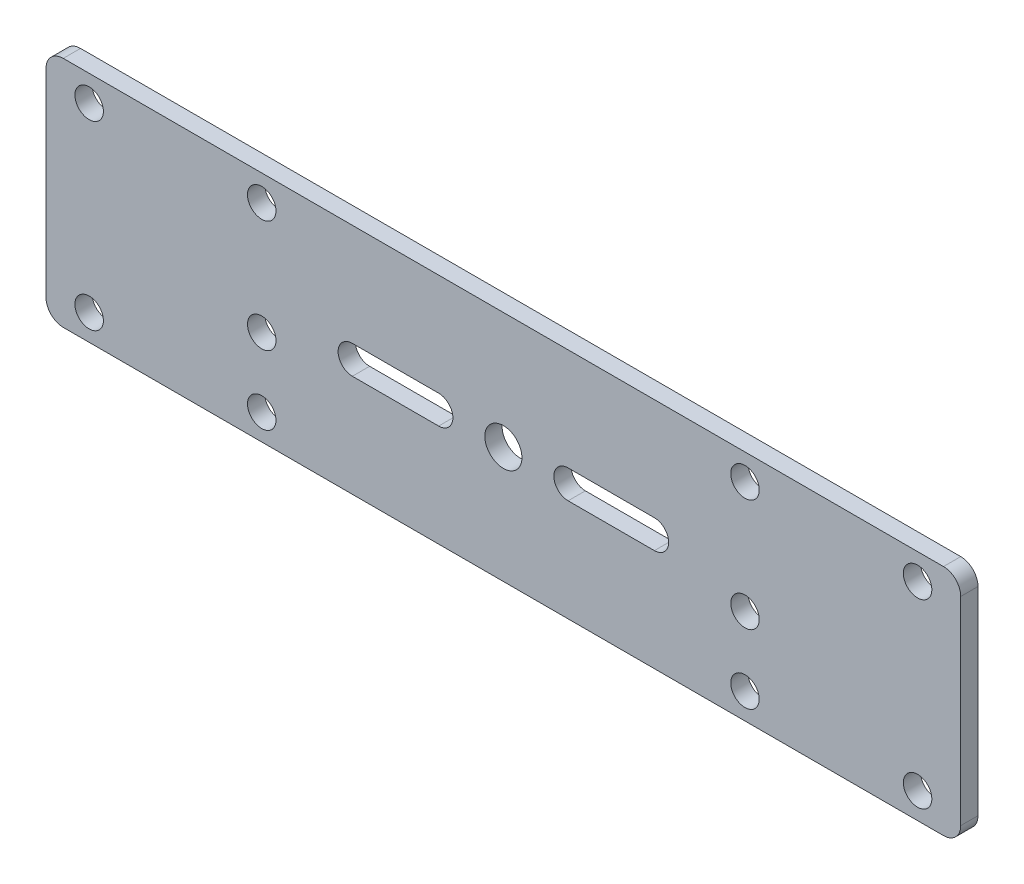
ISO-10303-21;
HEADER;
FILE_DESCRIPTION(('STEP AP214'),'2;1');
FILE_NAME('part.step','',(''),(''),'','','');
FILE_SCHEMA(('AUTOMOTIVE_DESIGN { 1 0 10303 214 1 1 1 1 }'));
ENDSEC;
DATA;
#1=APPLICATION_CONTEXT('core data for automotive mechanical design processes');
#2=APPLICATION_PROTOCOL_DEFINITION('international standard','automotive_design',2000,#1);
#3=PRODUCT_CONTEXT('',#1,'mechanical');
#4=PRODUCT('Part','Part','',(#3));
#5=PRODUCT_RELATED_PRODUCT_CATEGORY('part','',(#4));
#6=PRODUCT_DEFINITION_FORMATION('','',#4);
#7=PRODUCT_DEFINITION_CONTEXT('part definition',#1,'design');
#8=PRODUCT_DEFINITION('design','',#6,#7);
#9=PRODUCT_DEFINITION_SHAPE('','',#8);
#10=(LENGTH_UNIT() NAMED_UNIT(*) SI_UNIT(.MILLI.,.METRE.));
#11=(NAMED_UNIT(*) PLANE_ANGLE_UNIT() SI_UNIT($,.RADIAN.));
#12=(NAMED_UNIT(*) SI_UNIT($,.STERADIAN.) SOLID_ANGLE_UNIT());
#13=UNCERTAINTY_MEASURE_WITH_UNIT(LENGTH_MEASURE(1.E-05),#10,'distance_accuracy_value','');
#14=(GEOMETRIC_REPRESENTATION_CONTEXT(3) GLOBAL_UNCERTAINTY_ASSIGNED_CONTEXT((#13)) GLOBAL_UNIT_ASSIGNED_CONTEXT((#10,
#11,#12)) REPRESENTATION_CONTEXT('',''));
#15=CARTESIAN_POINT('',(0.,0.,0.));
#16=DIRECTION('',(0.,0.,1.));
#17=DIRECTION('',(1.,0.,0.));
#18=AXIS2_PLACEMENT_3D('',#15,#16,#17);
#19=CARTESIAN_POINT('',(0.,0.,2.));
#20=DIRECTION('',(0.,0.,1.));
#21=DIRECTION('',(1.,0.,0.));
#22=AXIS2_PLACEMENT_3D('',#19,#20,#21);
#23=PLANE('',#22);
#24=DIRECTION('',(0.,1.,0.));
#25=VECTOR('',#24,1.);
#26=CARTESIAN_POINT('',(53.,12.5,2.));
#27=LINE('',#26,#25);
#28=CARTESIAN_POINT('',(53.,-16.5,2.));
#29=VERTEX_POINT('',#28);
#30=CARTESIAN_POINT('',(53.,6.50000000000001,2.));
#31=VERTEX_POINT('',#30);
#32=EDGE_CURVE('E325',#29,#31,#27,.T.);
#33=ORIENTED_EDGE('',*,*,#32,.T.);
#34=CARTESIAN_POINT('',(51.,6.50000000000001,2.));
#35=DIRECTION('',(0.,0.,1.));
#36=DIRECTION('',(1.,0.,0.));
#37=AXIS2_PLACEMENT_3D('',#34,#35,#36);
#38=CIRCLE('',#37,2.);
#39=CARTESIAN_POINT('',(51.,8.50000000000001,2.));
#40=VERTEX_POINT('',#39);
#41=EDGE_CURVE('E385',#31,#40,#38,.T.);
#42=ORIENTED_EDGE('',*,*,#41,.T.);
#43=DIRECTION('',(1.,0.,0.));
#44=VECTOR('',#43,1.);
#45=CARTESIAN_POINT('',(-53.,8.50000000000001,2.));
#46=LINE('',#45,#44);
#47=CARTESIAN_POINT('',(-51.,8.50000000000001,2.));
#48=VERTEX_POINT('',#47);
#49=EDGE_CURVE('E430',#48,#40,#46,.T.);
#50=ORIENTED_EDGE('',*,*,#49,.F.);
#51=CARTESIAN_POINT('',(-51.,6.50000000000001,2.));
#52=DIRECTION('',(0.,0.,1.));
#53=DIRECTION('',(1.,0.,0.));
#54=AXIS2_PLACEMENT_3D('',#51,#52,#53);
#55=CIRCLE('',#54,2.);
#56=CARTESIAN_POINT('',(-53.,6.50000000000001,2.));
#57=VERTEX_POINT('',#56);
#58=EDGE_CURVE('E376',#48,#57,#55,.T.);
#59=ORIENTED_EDGE('',*,*,#58,.T.);
#60=DIRECTION('',(0.,-1.,0.));
#61=VECTOR('',#60,1.);
#62=CARTESIAN_POINT('',(-53.,12.5,2.));
#63=LINE('',#62,#61);
#64=CARTESIAN_POINT('',(-53.,-16.5,2.));
#65=VERTEX_POINT('',#64);
#66=EDGE_CURVE('E329',#57,#65,#63,.T.);
#67=ORIENTED_EDGE('',*,*,#66,.T.);
#68=CARTESIAN_POINT('',(-51.,-16.5,2.));
#69=DIRECTION('',(0.,0.,1.));
#70=DIRECTION('',(1.,0.,0.));
#71=AXIS2_PLACEMENT_3D('',#68,#69,#70);
#72=CIRCLE('',#71,2.);
#73=CARTESIAN_POINT('',(-51.,-18.5,2.));
#74=VERTEX_POINT('',#73);
#75=EDGE_CURVE('E379',#65,#74,#72,.T.);
#76=ORIENTED_EDGE('',*,*,#75,.T.);
#77=DIRECTION('',(1.,0.,0.));
#78=VECTOR('',#77,1.);
#79=CARTESIAN_POINT('',(-53.,-18.5,2.));
#80=LINE('',#79,#78);
#81=CARTESIAN_POINT('',(51.,-18.5,2.));
#82=VERTEX_POINT('',#81);
#83=EDGE_CURVE('E234',#74,#82,#80,.T.);
#84=ORIENTED_EDGE('',*,*,#83,.T.);
#85=CARTESIAN_POINT('',(51.,-16.5,2.));
#86=DIRECTION('',(0.,0.,1.));
#87=DIRECTION('',(1.,0.,0.));
#88=AXIS2_PLACEMENT_3D('',#85,#86,#87);
#89=CIRCLE('',#88,2.);
#90=EDGE_CURVE('E382',#82,#29,#89,.T.);
#91=ORIENTED_EDGE('',*,*,#90,.T.);
#92=EDGE_LOOP('',(#33,#42,#50,#59,#67,#76,#84,#91));
#93=FACE_BOUND('',#92,.T.);
#94=CARTESIAN_POINT('',(-17.5,-5.00000000000001,2.));
#95=DIRECTION('',(0.,0.,1.));
#96=DIRECTION('',(1.,0.,0.));
#97=AXIS2_PLACEMENT_3D('',#94,#95,#96);
#98=CIRCLE('',#97,1.65000000000001);
#99=CARTESIAN_POINT('',(-17.5,-3.35,2.));
#100=VERTEX_POINT('',#99);
#101=CARTESIAN_POINT('',(-17.5,-6.65000000000001,2.));
#102=VERTEX_POINT('',#101);
#103=EDGE_CURVE('E182',#100,#102,#98,.T.);
#104=ORIENTED_EDGE('',*,*,#103,.F.);
#105=DIRECTION('',(-1.,0.,0.));
#106=VECTOR('',#105,1.);
#107=CARTESIAN_POINT('',(-17.5,-3.35,2.));
#108=LINE('',#107,#106);
#109=CARTESIAN_POINT('',(-7.5,-3.35,2.));
#110=VERTEX_POINT('',#109);
#111=EDGE_CURVE('E186',#110,#100,#108,.T.);
#112=ORIENTED_EDGE('',*,*,#111,.F.);
#113=CARTESIAN_POINT('',(-7.50000000000001,-5.00000000000001,2.));
#114=DIRECTION('',(0.,0.,1.));
#115=DIRECTION('',(1.,0.,0.));
#116=AXIS2_PLACEMENT_3D('',#113,#114,#115);
#117=CIRCLE('',#116,1.65000000000001);
#118=CARTESIAN_POINT('',(-7.5,-6.65000000000002,2.));
#119=VERTEX_POINT('',#118);
#120=EDGE_CURVE('E164',#119,#110,#117,.T.);
#121=ORIENTED_EDGE('',*,*,#120,.F.);
#122=DIRECTION('',(1.,0.,0.));
#123=VECTOR('',#122,1.);
#124=CARTESIAN_POINT('',(-17.5,-6.65000000000001,2.));
#125=LINE('',#124,#123);
#126=EDGE_CURVE('E176',#102,#119,#125,.T.);
#127=ORIENTED_EDGE('',*,*,#126,.F.);
#128=EDGE_LOOP('',(#104,#112,#121,#127));
#129=FACE_BOUND('',#128,.T.);
#130=CARTESIAN_POINT('',(17.5,-5.00000000000001,2.));
#131=DIRECTION('',(0.,0.,1.));
#132=DIRECTION('',(-1.,0.,0.));
#133=AXIS2_PLACEMENT_3D('',#130,#131,#132);
#134=CIRCLE('',#133,1.65000000000001);
#135=CARTESIAN_POINT('',(17.5,-6.65000000000001,2.));
#136=VERTEX_POINT('',#135);
#137=CARTESIAN_POINT('',(17.5,-3.35,2.));
#138=VERTEX_POINT('',#137);
#139=EDGE_CURVE('E227',#136,#138,#134,.T.);
#140=ORIENTED_EDGE('',*,*,#139,.F.);
#141=DIRECTION('',(1.,0.,0.));
#142=VECTOR('',#141,1.);
#143=CARTESIAN_POINT('',(17.5,-6.65000000000001,2.));
#144=LINE('',#143,#142);
#145=CARTESIAN_POINT('',(7.5,-6.65000000000002,2.));
#146=VERTEX_POINT('',#145);
#147=EDGE_CURVE('E205',#146,#136,#144,.T.);
#148=ORIENTED_EDGE('',*,*,#147,.F.);
#149=CARTESIAN_POINT('',(7.50000000000001,-5.00000000000001,2.));
#150=DIRECTION('',(0.,0.,1.));
#151=DIRECTION('',(-1.,0.,0.));
#152=AXIS2_PLACEMENT_3D('',#149,#150,#151);
#153=CIRCLE('',#152,1.65000000000001);
#154=CARTESIAN_POINT('',(7.5,-3.35,2.));
#155=VERTEX_POINT('',#154);
#156=EDGE_CURVE('E219',#155,#146,#153,.T.);
#157=ORIENTED_EDGE('',*,*,#156,.F.);
#158=DIRECTION('',(-1.,0.,0.));
#159=VECTOR('',#158,1.);
#160=CARTESIAN_POINT('',(17.5,-3.35,2.));
#161=LINE('',#160,#159);
#162=EDGE_CURVE('E223',#138,#155,#161,.T.);
#163=ORIENTED_EDGE('',*,*,#162,.F.);
#164=EDGE_LOOP('',(#140,#148,#157,#163));
#165=FACE_BOUND('',#164,.T.);
#166=CARTESIAN_POINT('',(-48.,-15.5,2.));
#167=DIRECTION('',(0.,0.,1.));
#168=DIRECTION('',(1.,0.,0.));
#169=AXIS2_PLACEMENT_3D('',#166,#167,#168);
#170=CIRCLE('',#169,1.65);
#171=CARTESIAN_POINT('',(-46.35,-15.5,2.));
#172=VERTEX_POINT('',#171);
#173=EDGE_CURVE('E235',#172,#172,#170,.T.);
#174=ORIENTED_EDGE('',*,*,#173,.F.);
#175=EDGE_LOOP('',(#174));
#176=FACE_BOUND('',#175,.T.);
#177=CARTESIAN_POINT('',(28.,-15.5,2.));
#178=DIRECTION('',(0.,0.,1.));
#179=DIRECTION('',(-1.,0.,0.));
#180=AXIS2_PLACEMENT_3D('',#177,#178,#179);
#181=CIRCLE('',#180,1.65);
#182=CARTESIAN_POINT('',(26.35,-15.5,2.));
#183=VERTEX_POINT('',#182);
#184=EDGE_CURVE('E240',#183,#183,#181,.T.);
#185=ORIENTED_EDGE('',*,*,#184,.F.);
#186=EDGE_LOOP('',(#185));
#187=FACE_BOUND('',#186,.T.);
#188=CARTESIAN_POINT('',(-28.,-15.5,2.));
#189=DIRECTION('',(0.,0.,1.));
#190=DIRECTION('',(1.,0.,0.));
#191=AXIS2_PLACEMENT_3D('',#188,#189,#190);
#192=CIRCLE('',#191,1.65);
#193=CARTESIAN_POINT('',(-26.35,-15.5,2.));
#194=VERTEX_POINT('',#193);
#195=EDGE_CURVE('E255',#194,#194,#192,.T.);
#196=ORIENTED_EDGE('',*,*,#195,.F.);
#197=EDGE_LOOP('',(#196));
#198=FACE_BOUND('',#197,.T.);
#199=CARTESIAN_POINT('',(48.,-15.5,2.));
#200=DIRECTION('',(0.,0.,1.));
#201=DIRECTION('',(-1.,0.,0.));
#202=AXIS2_PLACEMENT_3D('',#199,#200,#201);
#203=CIRCLE('',#202,1.65);
#204=CARTESIAN_POINT('',(46.35,-15.5,2.));
#205=VERTEX_POINT('',#204);
#206=EDGE_CURVE('E239',#205,#205,#203,.T.);
#207=ORIENTED_EDGE('',*,*,#206,.F.);
#208=EDGE_LOOP('',(#207));
#209=FACE_BOUND('',#208,.T.);
#210=CARTESIAN_POINT('',(0.,-5.00000000000002,2.));
#211=DIRECTION('',(0.,0.,1.));
#212=DIRECTION('',(1.,0.,0.));
#213=AXIS2_PLACEMENT_3D('',#210,#211,#212);
#214=CIRCLE('',#213,2.15);
#215=CARTESIAN_POINT('',(2.15,-5.00000000000002,2.));
#216=VERTEX_POINT('',#215);
#217=EDGE_CURVE('E277',#216,#216,#214,.T.);
#218=ORIENTED_EDGE('',*,*,#217,.F.);
#219=EDGE_LOOP('',(#218));
#220=FACE_BOUND('',#219,.T.);
#221=CARTESIAN_POINT('',(28.,5.5,2.));
#222=DIRECTION('',(0.,0.,1.));
#223=DIRECTION('',(-1.,0.,0.));
#224=AXIS2_PLACEMENT_3D('',#221,#222,#223);
#225=CIRCLE('',#224,1.65);
#226=CARTESIAN_POINT('',(26.35,5.5,2.));
#227=VERTEX_POINT('',#226);
#228=EDGE_CURVE('E293',#227,#227,#225,.T.);
#229=ORIENTED_EDGE('',*,*,#228,.F.);
#230=EDGE_LOOP('',(#229));
#231=FACE_BOUND('',#230,.T.);
#232=CARTESIAN_POINT('',(-28.,-7.5,2.));
#233=DIRECTION('',(0.,0.,1.));
#234=DIRECTION('',(-1.,0.,0.));
#235=AXIS2_PLACEMENT_3D('',#232,#233,#234);
#236=CIRCLE('',#235,1.65);
#237=CARTESIAN_POINT('',(-29.65,-7.5,2.));
#238=VERTEX_POINT('',#237);
#239=EDGE_CURVE('E309',#238,#238,#236,.T.);
#240=ORIENTED_EDGE('',*,*,#239,.F.);
#241=EDGE_LOOP('',(#240));
#242=FACE_BOUND('',#241,.T.);
#243=CARTESIAN_POINT('',(-28.,5.5,2.));
#244=DIRECTION('',(0.,0.,1.));
#245=DIRECTION('',(1.,0.,0.));
#246=AXIS2_PLACEMENT_3D('',#243,#244,#245);
#247=CIRCLE('',#246,1.65);
#248=CARTESIAN_POINT('',(-26.35,5.5,2.));
#249=VERTEX_POINT('',#248);
#250=EDGE_CURVE('E317',#249,#249,#247,.T.);
#251=ORIENTED_EDGE('',*,*,#250,.F.);
#252=EDGE_LOOP('',(#251));
#253=FACE_BOUND('',#252,.T.);
#254=CARTESIAN_POINT('',(28.,-7.5,2.));
#255=DIRECTION('',(0.,0.,1.));
#256=DIRECTION('',(1.,0.,0.));
#257=AXIS2_PLACEMENT_3D('',#254,#255,#256);
#258=CIRCLE('',#257,1.65);
#259=CARTESIAN_POINT('',(29.65,-7.5,2.));
#260=VERTEX_POINT('',#259);
#261=EDGE_CURVE('E301',#260,#260,#258,.T.);
#262=ORIENTED_EDGE('',*,*,#261,.F.);
#263=EDGE_LOOP('',(#262));
#264=FACE_BOUND('',#263,.T.);
#265=CARTESIAN_POINT('',(48.,5.50000000000001,2.));
#266=DIRECTION('',(0.,0.,1.));
#267=DIRECTION('',(-1.,0.,0.));
#268=AXIS2_PLACEMENT_3D('',#265,#266,#267);
#269=CIRCLE('',#268,1.65);
#270=CARTESIAN_POINT('',(46.35,5.50000000000001,2.));
#271=VERTEX_POINT('',#270);
#272=EDGE_CURVE('E285',#271,#271,#269,.T.);
#273=ORIENTED_EDGE('',*,*,#272,.F.);
#274=EDGE_LOOP('',(#273));
#275=FACE_BOUND('',#274,.T.);
#276=CARTESIAN_POINT('',(-48.,5.5,2.));
#277=DIRECTION('',(0.,0.,1.));
#278=DIRECTION('',(1.,0.,0.));
#279=AXIS2_PLACEMENT_3D('',#276,#277,#278);
#280=CIRCLE('',#279,1.65);
#281=CARTESIAN_POINT('',(-46.35,5.5,2.));
#282=VERTEX_POINT('',#281);
#283=EDGE_CURVE('E269',#282,#282,#280,.T.);
#284=ORIENTED_EDGE('',*,*,#283,.F.);
#285=EDGE_LOOP('',(#284));
#286=FACE_BOUND('',#285,.T.);
#287=ADVANCED_FACE('F43',(#93,#129,#165,#176,#187,#198,#209,#220,#231,#242,#253,#264,#275,#286),
#23,.T.);
#288=CARTESIAN_POINT('',(0.,0.,0.));
#289=DIRECTION('',(0.,0.,1.));
#290=DIRECTION('',(1.,0.,0.));
#291=AXIS2_PLACEMENT_3D('',#288,#289,#290);
#292=PLANE('',#291);
#293=DIRECTION('',(-1.,0.,0.));
#294=VECTOR('',#293,1.);
#295=CARTESIAN_POINT('',(0.,-3.35,0.));
#296=LINE('',#295,#294);
#297=CARTESIAN_POINT('',(-7.5,-3.35,0.));
#298=VERTEX_POINT('',#297);
#299=CARTESIAN_POINT('',(-17.5,-3.35,0.));
#300=VERTEX_POINT('',#299);
#301=EDGE_CURVE('E361',#298,#300,#296,.T.);
#302=ORIENTED_EDGE('',*,*,#301,.T.);
#303=CARTESIAN_POINT('',(-17.5,-5.00000000000001,0.));
#304=DIRECTION('',(0.,0.,1.));
#305=DIRECTION('',(1.,0.,0.));
#306=AXIS2_PLACEMENT_3D('',#303,#304,#305);
#307=CIRCLE('',#306,1.65000000000001);
#308=CARTESIAN_POINT('',(-17.5,-6.65000000000001,0.));
#309=VERTEX_POINT('',#308);
#310=EDGE_CURVE('E365',#300,#309,#307,.T.);
#311=ORIENTED_EDGE('',*,*,#310,.T.);
#312=DIRECTION('',(1.,0.,0.));
#313=VECTOR('',#312,1.);
#314=CARTESIAN_POINT('',(0.,-6.65000000000003,0.));
#315=LINE('',#314,#313);
#316=CARTESIAN_POINT('',(-7.5,-6.65000000000002,0.));
#317=VERTEX_POINT('',#316);
#318=EDGE_CURVE('E356',#309,#317,#315,.T.);
#319=ORIENTED_EDGE('',*,*,#318,.T.);
#320=CARTESIAN_POINT('',(-7.50000000000001,-5.00000000000001,0.));
#321=DIRECTION('',(0.,0.,1.));
#322=DIRECTION('',(1.,0.,0.));
#323=AXIS2_PLACEMENT_3D('',#320,#321,#322);
#324=CIRCLE('',#323,1.65000000000001);
#325=EDGE_CURVE('E167',#317,#298,#324,.T.);
#326=ORIENTED_EDGE('',*,*,#325,.T.);
#327=EDGE_LOOP('',(#302,#311,#319,#326));
#328=FACE_BOUND('',#327,.T.);
#329=DIRECTION('',(1.,0.,0.));
#330=VECTOR('',#329,1.);
#331=CARTESIAN_POINT('',(0.,-6.65000000000003,0.));
#332=LINE('',#331,#330);
#333=CARTESIAN_POINT('',(7.5,-6.65000000000002,0.));
#334=VERTEX_POINT('',#333);
#335=CARTESIAN_POINT('',(17.5,-6.65000000000001,0.));
#336=VERTEX_POINT('',#335);
#337=EDGE_CURVE('E348',#334,#336,#332,.T.);
#338=ORIENTED_EDGE('',*,*,#337,.T.);
#339=CARTESIAN_POINT('',(17.5,-5.00000000000001,0.));
#340=DIRECTION('',(0.,0.,1.));
#341=DIRECTION('',(1.,0.,0.));
#342=AXIS2_PLACEMENT_3D('',#339,#340,#341);
#343=CIRCLE('',#342,1.65000000000001);
#344=CARTESIAN_POINT('',(17.5,-3.35,0.));
#345=VERTEX_POINT('',#344);
#346=EDGE_CURVE('E352',#336,#345,#343,.T.);
#347=ORIENTED_EDGE('',*,*,#346,.T.);
#348=DIRECTION('',(-1.,0.,0.));
#349=VECTOR('',#348,1.);
#350=CARTESIAN_POINT('',(0.,-3.35,0.));
#351=LINE('',#350,#349);
#352=CARTESIAN_POINT('',(7.5,-3.35,0.));
#353=VERTEX_POINT('',#352);
#354=EDGE_CURVE('E334',#345,#353,#351,.T.);
#355=ORIENTED_EDGE('',*,*,#354,.T.);
#356=CARTESIAN_POINT('',(7.50000000000001,-5.00000000000001,0.));
#357=DIRECTION('',(0.,0.,1.));
#358=DIRECTION('',(1.,0.,0.));
#359=AXIS2_PLACEMENT_3D('',#356,#357,#358);
#360=CIRCLE('',#359,1.65000000000001);
#361=EDGE_CURVE('E344',#353,#334,#360,.T.);
#362=ORIENTED_EDGE('',*,*,#361,.T.);
#363=EDGE_LOOP('',(#338,#347,#355,#362));
#364=FACE_BOUND('',#363,.T.);
#365=CARTESIAN_POINT('',(-48.,-15.5,0.));
#366=DIRECTION('',(0.,0.,1.));
#367=DIRECTION('',(1.,0.,0.));
#368=AXIS2_PLACEMENT_3D('',#365,#366,#367);
#369=CIRCLE('',#368,1.65);
#370=CARTESIAN_POINT('',(-46.35,-15.5,0.));
#371=VERTEX_POINT('',#370);
#372=EDGE_CURVE('E230',#371,#371,#369,.T.);
#373=ORIENTED_EDGE('',*,*,#372,.T.);
#374=EDGE_LOOP('',(#373));
#375=FACE_BOUND('',#374,.T.);
#376=CARTESIAN_POINT('',(28.,-15.5,0.));
#377=DIRECTION('',(0.,0.,1.));
#378=DIRECTION('',(-1.,0.,0.));
#379=AXIS2_PLACEMENT_3D('',#376,#377,#378);
#380=CIRCLE('',#379,1.65);
#381=CARTESIAN_POINT('',(26.35,-15.5,0.));
#382=VERTEX_POINT('',#381);
#383=EDGE_CURVE('E196',#382,#382,#380,.T.);
#384=ORIENTED_EDGE('',*,*,#383,.T.);
#385=EDGE_LOOP('',(#384));
#386=FACE_BOUND('',#385,.T.);
#387=CARTESIAN_POINT('',(-28.,-15.5,0.));
#388=DIRECTION('',(0.,0.,1.));
#389=DIRECTION('',(1.,0.,0.));
#390=AXIS2_PLACEMENT_3D('',#387,#388,#389);
#391=CIRCLE('',#390,1.65);
#392=CARTESIAN_POINT('',(-26.35,-15.5,0.));
#393=VERTEX_POINT('',#392);
#394=EDGE_CURVE('E244',#393,#393,#391,.T.);
#395=ORIENTED_EDGE('',*,*,#394,.T.);
#396=EDGE_LOOP('',(#395));
#397=FACE_BOUND('',#396,.T.);
#398=CARTESIAN_POINT('',(48.,-15.5,0.));
#399=DIRECTION('',(0.,0.,1.));
#400=DIRECTION('',(-1.,0.,0.));
#401=AXIS2_PLACEMENT_3D('',#398,#399,#400);
#402=CIRCLE('',#401,1.65);
#403=CARTESIAN_POINT('',(46.35,-15.5,0.));
#404=VERTEX_POINT('',#403);
#405=EDGE_CURVE('E251',#404,#404,#402,.T.);
#406=ORIENTED_EDGE('',*,*,#405,.T.);
#407=EDGE_LOOP('',(#406));
#408=FACE_BOUND('',#407,.T.);
#409=DIRECTION('',(1.,0.,0.));
#410=VECTOR('',#409,1.);
#411=CARTESIAN_POINT('',(-53.,8.50000000000001,0.));
#412=LINE('',#411,#410);
#413=CARTESIAN_POINT('',(-51.,8.50000000000001,0.));
#414=VERTEX_POINT('',#413);
#415=CARTESIAN_POINT('',(51.,8.50000000000001,0.));
#416=VERTEX_POINT('',#415);
#417=EDGE_CURVE('E215',#414,#416,#412,.T.);
#418=ORIENTED_EDGE('',*,*,#417,.T.);
#419=CARTESIAN_POINT('',(51.,6.50000000000001,0.));
#420=DIRECTION('',(0.,0.,1.));
#421=DIRECTION('',(1.,0.,0.));
#422=AXIS2_PLACEMENT_3D('',#419,#420,#421);
#423=CIRCLE('',#422,2.);
#424=CARTESIAN_POINT('',(53.,6.50000000000001,0.));
#425=VERTEX_POINT('',#424);
#426=EDGE_CURVE('E403',#416,#425,#423,.F.);
#427=ORIENTED_EDGE('',*,*,#426,.T.);
#428=DIRECTION('',(0.,1.,0.));
#429=VECTOR('',#428,1.);
#430=CARTESIAN_POINT('',(53.,12.5,0.));
#431=LINE('',#430,#429);
#432=CARTESIAN_POINT('',(53.,-16.5,0.));
#433=VERTEX_POINT('',#432);
#434=EDGE_CURVE('E321',#433,#425,#431,.T.);
#435=ORIENTED_EDGE('',*,*,#434,.F.);
#436=CARTESIAN_POINT('',(51.,-16.5,0.));
#437=DIRECTION('',(0.,0.,1.));
#438=DIRECTION('',(1.,0.,0.));
#439=AXIS2_PLACEMENT_3D('',#436,#437,#438);
#440=CIRCLE('',#439,2.);
#441=CARTESIAN_POINT('',(51.,-18.5,0.));
#442=VERTEX_POINT('',#441);
#443=EDGE_CURVE('E59',#433,#442,#440,.F.);
#444=ORIENTED_EDGE('',*,*,#443,.T.);
#445=DIRECTION('',(1.,0.,0.));
#446=VECTOR('',#445,1.);
#447=CARTESIAN_POINT('',(-53.,-18.5,0.));
#448=LINE('',#447,#446);
#449=CARTESIAN_POINT('',(-51.,-18.5,0.));
#450=VERTEX_POINT('',#449);
#451=EDGE_CURVE('E262',#450,#442,#448,.T.);
#452=ORIENTED_EDGE('',*,*,#451,.F.);
#453=CARTESIAN_POINT('',(-51.,-16.5,0.));
#454=DIRECTION('',(0.,0.,1.));
#455=DIRECTION('',(1.,0.,0.));
#456=AXIS2_PLACEMENT_3D('',#453,#454,#455);
#457=CIRCLE('',#456,2.);
#458=CARTESIAN_POINT('',(-53.,-16.5,0.));
#459=VERTEX_POINT('',#458);
#460=EDGE_CURVE('E398',#450,#459,#457,.F.);
#461=ORIENTED_EDGE('',*,*,#460,.T.);
#462=DIRECTION('',(0.,-1.,0.));
#463=VECTOR('',#462,1.);
#464=CARTESIAN_POINT('',(-53.,12.5,0.));
#465=LINE('',#464,#463);
#466=CARTESIAN_POINT('',(-53.,6.50000000000001,0.));
#467=VERTEX_POINT('',#466);
#468=EDGE_CURVE('E330',#467,#459,#465,.T.);
#469=ORIENTED_EDGE('',*,*,#468,.F.);
#470=CARTESIAN_POINT('',(-51.,6.50000000000001,0.));
#471=DIRECTION('',(0.,0.,1.));
#472=DIRECTION('',(1.,0.,0.));
#473=AXIS2_PLACEMENT_3D('',#470,#471,#472);
#474=CIRCLE('',#473,2.);
#475=EDGE_CURVE('E395',#467,#414,#474,.F.);
#476=ORIENTED_EDGE('',*,*,#475,.T.);
#477=EDGE_LOOP('',(#418,#427,#435,#444,#452,#461,#469,#476));
#478=FACE_BOUND('',#477,.T.);
#479=CARTESIAN_POINT('',(-28.,5.5,0.));
#480=DIRECTION('',(0.,0.,1.));
#481=DIRECTION('',(1.,0.,0.));
#482=AXIS2_PLACEMENT_3D('',#479,#480,#481);
#483=CIRCLE('',#482,1.65);
#484=CARTESIAN_POINT('',(-26.35,5.5,0.));
#485=VERTEX_POINT('',#484);
#486=EDGE_CURVE('E313',#485,#485,#483,.T.);
#487=ORIENTED_EDGE('',*,*,#486,.T.);
#488=EDGE_LOOP('',(#487));
#489=FACE_BOUND('',#488,.T.);
#490=CARTESIAN_POINT('',(-28.,-7.5,0.));
#491=DIRECTION('',(0.,0.,1.));
#492=DIRECTION('',(-1.,0.,0.));
#493=AXIS2_PLACEMENT_3D('',#490,#491,#492);
#494=CIRCLE('',#493,1.65);
#495=CARTESIAN_POINT('',(-29.65,-7.5,0.));
#496=VERTEX_POINT('',#495);
#497=EDGE_CURVE('E305',#496,#496,#494,.T.);
#498=ORIENTED_EDGE('',*,*,#497,.T.);
#499=EDGE_LOOP('',(#498));
#500=FACE_BOUND('',#499,.T.);
#501=CARTESIAN_POINT('',(28.,-7.5,0.));
#502=DIRECTION('',(0.,0.,1.));
#503=DIRECTION('',(1.,0.,0.));
#504=AXIS2_PLACEMENT_3D('',#501,#502,#503);
#505=CIRCLE('',#504,1.65);
#506=CARTESIAN_POINT('',(29.65,-7.5,0.));
#507=VERTEX_POINT('',#506);
#508=EDGE_CURVE('E297',#507,#507,#505,.T.);
#509=ORIENTED_EDGE('',*,*,#508,.T.);
#510=EDGE_LOOP('',(#509));
#511=FACE_BOUND('',#510,.T.);
#512=CARTESIAN_POINT('',(28.,5.5,0.));
#513=DIRECTION('',(0.,0.,1.));
#514=DIRECTION('',(-1.,0.,0.));
#515=AXIS2_PLACEMENT_3D('',#512,#513,#514);
#516=CIRCLE('',#515,1.65);
#517=CARTESIAN_POINT('',(26.35,5.5,0.));
#518=VERTEX_POINT('',#517);
#519=EDGE_CURVE('E289',#518,#518,#516,.T.);
#520=ORIENTED_EDGE('',*,*,#519,.T.);
#521=EDGE_LOOP('',(#520));
#522=FACE_BOUND('',#521,.T.);
#523=CARTESIAN_POINT('',(48.,5.50000000000001,0.));
#524=DIRECTION('',(0.,0.,1.));
#525=DIRECTION('',(-1.,0.,0.));
#526=AXIS2_PLACEMENT_3D('',#523,#524,#525);
#527=CIRCLE('',#526,1.65);
#528=CARTESIAN_POINT('',(46.35,5.50000000000001,0.));
#529=VERTEX_POINT('',#528);
#530=EDGE_CURVE('E281',#529,#529,#527,.T.);
#531=ORIENTED_EDGE('',*,*,#530,.T.);
#532=EDGE_LOOP('',(#531));
#533=FACE_BOUND('',#532,.T.);
#534=CARTESIAN_POINT('',(0.,-5.00000000000002,0.));
#535=DIRECTION('',(0.,0.,1.));
#536=DIRECTION('',(1.,0.,0.));
#537=AXIS2_PLACEMENT_3D('',#534,#535,#536);
#538=CIRCLE('',#537,2.15);
#539=CARTESIAN_POINT('',(2.15,-5.00000000000002,0.));
#540=VERTEX_POINT('',#539);
#541=EDGE_CURVE('E273',#540,#540,#538,.T.);
#542=ORIENTED_EDGE('',*,*,#541,.T.);
#543=EDGE_LOOP('',(#542));
#544=FACE_BOUND('',#543,.T.);
#545=CARTESIAN_POINT('',(-48.,5.5,0.));
#546=DIRECTION('',(0.,0.,1.));
#547=DIRECTION('',(1.,0.,0.));
#548=AXIS2_PLACEMENT_3D('',#545,#546,#547);
#549=CIRCLE('',#548,1.65);
#550=CARTESIAN_POINT('',(-46.35,5.5,0.));
#551=VERTEX_POINT('',#550);
#552=EDGE_CURVE('E265',#551,#551,#549,.T.);
#553=ORIENTED_EDGE('',*,*,#552,.T.);
#554=EDGE_LOOP('',(#553));
#555=FACE_BOUND('',#554,.T.);
#556=ADVANCED_FACE('F421',(#328,#364,#375,#386,#397,#408,#478,#489,#500,#511,#522,#533,#544,
#555),#292,.F.);
#557=CARTESIAN_POINT('',(53.,12.5,2.));
#558=DIRECTION('',(-1.,0.,0.));
#559=DIRECTION('',(0.,0.,1.));
#560=AXIS2_PLACEMENT_3D('',#557,#558,#559);
#561=PLANE('',#560);
#562=ORIENTED_EDGE('',*,*,#434,.T.);
#563=DIRECTION('',(0.,0.,1.));
#564=VECTOR('',#563,1.);
#565=CARTESIAN_POINT('',(53.,6.50000000000001,2.));
#566=LINE('',#565,#564);
#567=EDGE_CURVE('E372',#425,#31,#566,.T.);
#568=ORIENTED_EDGE('',*,*,#567,.T.);
#569=ORIENTED_EDGE('',*,*,#32,.F.);
#570=DIRECTION('',(0.,0.,1.));
#571=VECTOR('',#570,1.);
#572=CARTESIAN_POINT('',(53.,-16.5,0.));
#573=LINE('',#572,#571);
#574=EDGE_CURVE('E369',#29,#433,#573,.F.);
#575=ORIENTED_EDGE('',*,*,#574,.T.);
#576=EDGE_LOOP('',(#562,#568,#569,#575));
#577=FACE_BOUND('',#576,.T.);
#578=ADVANCED_FACE('F446',(#577),#561,.F.);
#579=CARTESIAN_POINT('',(-53.,12.5,2.));
#580=DIRECTION('',(1.,0.,0.));
#581=DIRECTION('',(0.,0.,-1.));
#582=AXIS2_PLACEMENT_3D('',#579,#580,#581);
#583=PLANE('',#582);
#584=ORIENTED_EDGE('',*,*,#468,.T.);
#585=DIRECTION('',(0.,0.,1.));
#586=VECTOR('',#585,1.);
#587=CARTESIAN_POINT('',(-53.,-16.5,2.));
#588=LINE('',#587,#586);
#589=EDGE_CURVE('E11',#459,#65,#588,.T.);
#590=ORIENTED_EDGE('',*,*,#589,.T.);
#591=ORIENTED_EDGE('',*,*,#66,.F.);
#592=DIRECTION('',(0.,0.,1.));
#593=VECTOR('',#592,1.);
#594=CARTESIAN_POINT('',(-53.,6.50000000000001,2.));
#595=LINE('',#594,#593);
#596=EDGE_CURVE('E52',#57,#467,#595,.F.);
#597=ORIENTED_EDGE('',*,*,#596,.T.);
#598=EDGE_LOOP('',(#584,#590,#591,#597));
#599=FACE_BOUND('',#598,.T.);
#600=ADVANCED_FACE('F416',(#599),#583,.F.);
#601=CARTESIAN_POINT('',(-28.,5.5,2.));
#602=DIRECTION('',(0.,0.,-1.));
#603=DIRECTION('',(-1.,0.,0.));
#604=AXIS2_PLACEMENT_3D('',#601,#602,#603);
#605=CYLINDRICAL_SURFACE('',#604,1.65);
#606=ORIENTED_EDGE('',*,*,#250,.T.);
#607=EDGE_LOOP('',(#606));
#608=FACE_BOUND('',#607,.T.);
#609=ORIENTED_EDGE('',*,*,#486,.F.);
#610=EDGE_LOOP('',(#609));
#611=FACE_BOUND('',#610,.T.);
#612=ADVANCED_FACE('F513',(#608,#611),#605,.F.);
#613=CARTESIAN_POINT('',(-28.,-7.5,2.));
#614=DIRECTION('',(0.,0.,-1.));
#615=DIRECTION('',(-1.,0.,0.));
#616=AXIS2_PLACEMENT_3D('',#613,#614,#615);
#617=CYLINDRICAL_SURFACE('',#616,1.65);
#618=ORIENTED_EDGE('',*,*,#239,.T.);
#619=EDGE_LOOP('',(#618));
#620=FACE_BOUND('',#619,.T.);
#621=ORIENTED_EDGE('',*,*,#497,.F.);
#622=EDGE_LOOP('',(#621));
#623=FACE_BOUND('',#622,.T.);
#624=ADVANCED_FACE('F509',(#620,#623),#617,.F.);
#625=CARTESIAN_POINT('',(28.,-7.5,2.));
#626=DIRECTION('',(0.,0.,-1.));
#627=DIRECTION('',(-1.,0.,0.));
#628=AXIS2_PLACEMENT_3D('',#625,#626,#627);
#629=CYLINDRICAL_SURFACE('',#628,1.65);
#630=ORIENTED_EDGE('',*,*,#261,.T.);
#631=EDGE_LOOP('',(#630));
#632=FACE_BOUND('',#631,.T.);
#633=ORIENTED_EDGE('',*,*,#508,.F.);
#634=EDGE_LOOP('',(#633));
#635=FACE_BOUND('',#634,.T.);
#636=ADVANCED_FACE('F505',(#632,#635),#629,.F.);
#637=CARTESIAN_POINT('',(28.,5.5,2.));
#638=DIRECTION('',(0.,0.,-1.));
#639=DIRECTION('',(-1.,0.,0.));
#640=AXIS2_PLACEMENT_3D('',#637,#638,#639);
#641=CYLINDRICAL_SURFACE('',#640,1.65);
#642=ORIENTED_EDGE('',*,*,#228,.T.);
#643=EDGE_LOOP('',(#642));
#644=FACE_BOUND('',#643,.T.);
#645=ORIENTED_EDGE('',*,*,#519,.F.);
#646=EDGE_LOOP('',(#645));
#647=FACE_BOUND('',#646,.T.);
#648=ADVANCED_FACE('F501',(#644,#647),#641,.F.);
#649=CARTESIAN_POINT('',(48.,5.50000000000001,2.));
#650=DIRECTION('',(0.,0.,-1.));
#651=DIRECTION('',(-1.,0.,0.));
#652=AXIS2_PLACEMENT_3D('',#649,#650,#651);
#653=CYLINDRICAL_SURFACE('',#652,1.65);
#654=ORIENTED_EDGE('',*,*,#272,.T.);
#655=EDGE_LOOP('',(#654));
#656=FACE_BOUND('',#655,.T.);
#657=ORIENTED_EDGE('',*,*,#530,.F.);
#658=EDGE_LOOP('',(#657));
#659=FACE_BOUND('',#658,.T.);
#660=ADVANCED_FACE('F494',(#656,#659),#653,.F.);
#661=CARTESIAN_POINT('',(0.,-5.00000000000002,2.));
#662=DIRECTION('',(0.,0.,-1.));
#663=DIRECTION('',(-1.,0.,0.));
#664=AXIS2_PLACEMENT_3D('',#661,#662,#663);
#665=CYLINDRICAL_SURFACE('',#664,2.15);
#666=ORIENTED_EDGE('',*,*,#217,.T.);
#667=EDGE_LOOP('',(#666));
#668=FACE_BOUND('',#667,.T.);
#669=ORIENTED_EDGE('',*,*,#541,.F.);
#670=EDGE_LOOP('',(#669));
#671=FACE_BOUND('',#670,.T.);
#672=ADVANCED_FACE('F485',(#668,#671),#665,.F.);
#673=CARTESIAN_POINT('',(-48.,5.5,2.));
#674=DIRECTION('',(0.,0.,-1.));
#675=DIRECTION('',(-1.,0.,0.));
#676=AXIS2_PLACEMENT_3D('',#673,#674,#675);
#677=CYLINDRICAL_SURFACE('',#676,1.65);
#678=ORIENTED_EDGE('',*,*,#283,.T.);
#679=EDGE_LOOP('',(#678));
#680=FACE_BOUND('',#679,.T.);
#681=ORIENTED_EDGE('',*,*,#552,.F.);
#682=EDGE_LOOP('',(#681));
#683=FACE_BOUND('',#682,.T.);
#684=ADVANCED_FACE('F482',(#680,#683),#677,.F.);
#685=CARTESIAN_POINT('',(-53.,-18.5,0.));
#686=DIRECTION('',(0.,-1.,0.));
#687=DIRECTION('',(0.,0.,-1.));
#688=AXIS2_PLACEMENT_3D('',#685,#686,#687);
#689=PLANE('',#688);
#690=ORIENTED_EDGE('',*,*,#451,.T.);
#691=DIRECTION('',(0.,0.,1.));
#692=VECTOR('',#691,1.);
#693=CARTESIAN_POINT('',(51.,-18.5,2.));
#694=LINE('',#693,#692);
#695=EDGE_CURVE('E408',#442,#82,#694,.T.);
#696=ORIENTED_EDGE('',*,*,#695,.T.);
#697=ORIENTED_EDGE('',*,*,#83,.F.);
#698=DIRECTION('',(0.,0.,1.));
#699=VECTOR('',#698,1.);
#700=CARTESIAN_POINT('',(-51.,-18.5,0.));
#701=LINE('',#700,#699);
#702=EDGE_CURVE('E66',#74,#450,#701,.F.);
#703=ORIENTED_EDGE('',*,*,#702,.T.);
#704=EDGE_LOOP('',(#690,#696,#697,#703));
#705=FACE_BOUND('',#704,.T.);
#706=ADVANCED_FACE('F461',(#705),#689,.T.);
#707=CARTESIAN_POINT('',(48.,-15.5,0.));
#708=DIRECTION('',(0.,0.,1.));
#709=DIRECTION('',(1.,0.,0.));
#710=AXIS2_PLACEMENT_3D('',#707,#708,#709);
#711=CYLINDRICAL_SURFACE('',#710,1.65);
#712=ORIENTED_EDGE('',*,*,#405,.F.);
#713=EDGE_LOOP('',(#712));
#714=FACE_BOUND('',#713,.T.);
#715=ORIENTED_EDGE('',*,*,#206,.T.);
#716=EDGE_LOOP('',(#715));
#717=FACE_BOUND('',#716,.T.);
#718=ADVANCED_FACE('F457',(#714,#717),#711,.F.);
#719=CARTESIAN_POINT('',(-28.,-15.5,0.));
#720=DIRECTION('',(0.,0.,1.));
#721=DIRECTION('',(1.,0.,0.));
#722=AXIS2_PLACEMENT_3D('',#719,#720,#721);
#723=CYLINDRICAL_SURFACE('',#722,1.65);
#724=ORIENTED_EDGE('',*,*,#394,.F.);
#725=EDGE_LOOP('',(#724));
#726=FACE_BOUND('',#725,.T.);
#727=ORIENTED_EDGE('',*,*,#195,.T.);
#728=EDGE_LOOP('',(#727));
#729=FACE_BOUND('',#728,.T.);
#730=ADVANCED_FACE('F460',(#726,#729),#723,.F.);
#731=CARTESIAN_POINT('',(28.,-15.5,0.));
#732=DIRECTION('',(0.,0.,1.));
#733=DIRECTION('',(1.,0.,0.));
#734=AXIS2_PLACEMENT_3D('',#731,#732,#733);
#735=CYLINDRICAL_SURFACE('',#734,1.65);
#736=ORIENTED_EDGE('',*,*,#383,.F.);
#737=EDGE_LOOP('',(#736));
#738=FACE_BOUND('',#737,.T.);
#739=ORIENTED_EDGE('',*,*,#184,.T.);
#740=EDGE_LOOP('',(#739));
#741=FACE_BOUND('',#740,.T.);
#742=ADVANCED_FACE('F699',(#738,#741),#735,.F.);
#743=CARTESIAN_POINT('',(-48.,-15.5,0.));
#744=DIRECTION('',(0.,0.,1.));
#745=DIRECTION('',(1.,0.,0.));
#746=AXIS2_PLACEMENT_3D('',#743,#744,#745);
#747=CYLINDRICAL_SURFACE('',#746,1.65);
#748=ORIENTED_EDGE('',*,*,#372,.F.);
#749=EDGE_LOOP('',(#748));
#750=FACE_BOUND('',#749,.T.);
#751=ORIENTED_EDGE('',*,*,#173,.T.);
#752=EDGE_LOOP('',(#751));
#753=FACE_BOUND('',#752,.T.);
#754=ADVANCED_FACE('F688',(#750,#753),#747,.F.);
#755=CARTESIAN_POINT('',(17.5,-5.00000000000001,-8.));
#756=DIRECTION('',(0.,0.,1.));
#757=DIRECTION('',(1.,0.,0.));
#758=AXIS2_PLACEMENT_3D('',#755,#756,#757);
#759=CYLINDRICAL_SURFACE('',#758,1.65000000000001);
#760=DIRECTION('',(0.,0.,1.));
#761=VECTOR('',#760,1.);
#762=CARTESIAN_POINT('',(17.5,-6.65000000000001,-8.));
#763=LINE('',#762,#761);
#764=EDGE_CURVE('E212',#336,#136,#763,.T.);
#765=ORIENTED_EDGE('',*,*,#764,.T.);
#766=ORIENTED_EDGE('',*,*,#139,.T.);
#767=DIRECTION('',(0.,0.,1.));
#768=VECTOR('',#767,1.);
#769=CARTESIAN_POINT('',(17.5,-3.35,-8.));
#770=LINE('',#769,#768);
#771=EDGE_CURVE('E201',#345,#138,#770,.T.);
#772=ORIENTED_EDGE('',*,*,#771,.F.);
#773=ORIENTED_EDGE('',*,*,#346,.F.);
#774=EDGE_LOOP('',(#765,#766,#772,#773));
#775=FACE_BOUND('',#774,.T.);
#776=ADVANCED_FACE('F677',(#775),#759,.F.);
#777=CARTESIAN_POINT('',(17.5,-6.65000000000001,-8.));
#778=DIRECTION('',(0.,-1.,0.));
#779=DIRECTION('',(1.,0.,0.));
#780=AXIS2_PLACEMENT_3D('',#777,#778,#779);
#781=PLANE('',#780);
#782=DIRECTION('',(0.,0.,1.));
#783=VECTOR('',#782,1.);
#784=CARTESIAN_POINT('',(7.5,-6.65000000000002,-8.));
#785=LINE('',#784,#783);
#786=EDGE_CURVE('E209',#334,#146,#785,.T.);
#787=ORIENTED_EDGE('',*,*,#786,.T.);
#788=ORIENTED_EDGE('',*,*,#147,.T.);
#789=ORIENTED_EDGE('',*,*,#764,.F.);
#790=ORIENTED_EDGE('',*,*,#337,.F.);
#791=EDGE_LOOP('',(#787,#788,#789,#790));
#792=FACE_BOUND('',#791,.T.);
#793=ADVANCED_FACE('F666',(#792),#781,.F.);
#794=CARTESIAN_POINT('',(7.50000000000001,-5.00000000000001,-8.));
#795=DIRECTION('',(0.,0.,1.));
#796=DIRECTION('',(1.,0.,0.));
#797=AXIS2_PLACEMENT_3D('',#794,#795,#796);
#798=CYLINDRICAL_SURFACE('',#797,1.65000000000001);
#799=DIRECTION('',(0.,0.,1.));
#800=VECTOR('',#799,1.);
#801=CARTESIAN_POINT('',(7.5,-3.35,-8.));
#802=LINE('',#801,#800);
#803=EDGE_CURVE('E206',#353,#155,#802,.T.);
#804=ORIENTED_EDGE('',*,*,#803,.T.);
#805=ORIENTED_EDGE('',*,*,#156,.T.);
#806=ORIENTED_EDGE('',*,*,#786,.F.);
#807=ORIENTED_EDGE('',*,*,#361,.F.);
#808=EDGE_LOOP('',(#804,#805,#806,#807));
#809=FACE_BOUND('',#808,.T.);
#810=ADVANCED_FACE('F655',(#809),#798,.F.);
#811=CARTESIAN_POINT('',(17.5,-3.35,-8.));
#812=DIRECTION('',(0.,1.,0.));
#813=DIRECTION('',(0.,0.,1.));
#814=AXIS2_PLACEMENT_3D('',#811,#812,#813);
#815=PLANE('',#814);
#816=ORIENTED_EDGE('',*,*,#771,.T.);
#817=ORIENTED_EDGE('',*,*,#162,.T.);
#818=ORIENTED_EDGE('',*,*,#803,.F.);
#819=ORIENTED_EDGE('',*,*,#354,.F.);
#820=EDGE_LOOP('',(#816,#817,#818,#819));
#821=FACE_BOUND('',#820,.T.);
#822=ADVANCED_FACE('F645',(#821),#815,.F.);
#823=CARTESIAN_POINT('',(-17.5,-5.00000000000001,-8.));
#824=DIRECTION('',(0.,0.,1.));
#825=DIRECTION('',(1.,0.,0.));
#826=AXIS2_PLACEMENT_3D('',#823,#824,#825);
#827=CYLINDRICAL_SURFACE('',#826,1.65000000000001);
#828=DIRECTION('',(0.,0.,1.));
#829=VECTOR('',#828,1.);
#830=CARTESIAN_POINT('',(-17.5,-3.35,-8.));
#831=LINE('',#830,#829);
#832=EDGE_CURVE('E193',#300,#100,#831,.T.);
#833=ORIENTED_EDGE('',*,*,#832,.T.);
#834=ORIENTED_EDGE('',*,*,#103,.T.);
#835=DIRECTION('',(0.,0.,1.));
#836=VECTOR('',#835,1.);
#837=CARTESIAN_POINT('',(-17.5,-6.65000000000001,-8.));
#838=LINE('',#837,#836);
#839=EDGE_CURVE('E172',#309,#102,#838,.T.);
#840=ORIENTED_EDGE('',*,*,#839,.F.);
#841=ORIENTED_EDGE('',*,*,#310,.F.);
#842=EDGE_LOOP('',(#833,#834,#840,#841));
#843=FACE_BOUND('',#842,.T.);
#844=ADVANCED_FACE('F439',(#843),#827,.F.);
#845=CARTESIAN_POINT('',(-17.5,-3.35,-8.));
#846=DIRECTION('',(0.,1.,0.));
#847=DIRECTION('',(0.,0.,1.));
#848=AXIS2_PLACEMENT_3D('',#845,#846,#847);
#849=PLANE('',#848);
#850=DIRECTION('',(0.,0.,1.));
#851=VECTOR('',#850,1.);
#852=CARTESIAN_POINT('',(-7.5,-3.35,-8.));
#853=LINE('',#852,#851);
#854=EDGE_CURVE('E171',#298,#110,#853,.T.);
#855=ORIENTED_EDGE('',*,*,#854,.T.);
#856=ORIENTED_EDGE('',*,*,#111,.T.);
#857=ORIENTED_EDGE('',*,*,#832,.F.);
#858=ORIENTED_EDGE('',*,*,#301,.F.);
#859=EDGE_LOOP('',(#855,#856,#857,#858));
#860=FACE_BOUND('',#859,.T.);
#861=ADVANCED_FACE('F442',(#860),#849,.F.);
#862=CARTESIAN_POINT('',(-7.50000000000001,-5.00000000000001,-8.));
#863=DIRECTION('',(0.,0.,1.));
#864=DIRECTION('',(1.,0.,0.));
#865=AXIS2_PLACEMENT_3D('',#862,#863,#864);
#866=CYLINDRICAL_SURFACE('',#865,1.65000000000001);
#867=DIRECTION('',(0.,0.,1.));
#868=VECTOR('',#867,1.);
#869=CARTESIAN_POINT('',(-7.5,-6.65000000000002,-8.));
#870=LINE('',#869,#868);
#871=EDGE_CURVE('E159',#317,#119,#870,.T.);
#872=ORIENTED_EDGE('',*,*,#871,.T.);
#873=ORIENTED_EDGE('',*,*,#120,.T.);
#874=ORIENTED_EDGE('',*,*,#854,.F.);
#875=ORIENTED_EDGE('',*,*,#325,.F.);
#876=EDGE_LOOP('',(#872,#873,#874,#875));
#877=FACE_BOUND('',#876,.T.);
#878=ADVANCED_FACE('F161',(#877),#866,.F.);
#879=CARTESIAN_POINT('',(-17.5,-6.65000000000001,-8.));
#880=DIRECTION('',(0.,-1.,0.));
#881=DIRECTION('',(1.,0.,0.));
#882=AXIS2_PLACEMENT_3D('',#879,#880,#881);
#883=PLANE('',#882);
#884=ORIENTED_EDGE('',*,*,#839,.T.);
#885=ORIENTED_EDGE('',*,*,#126,.T.);
#886=ORIENTED_EDGE('',*,*,#871,.F.);
#887=ORIENTED_EDGE('',*,*,#318,.F.);
#888=EDGE_LOOP('',(#884,#885,#886,#887));
#889=FACE_BOUND('',#888,.T.);
#890=ADVANCED_FACE('F177',(#889),#883,.F.);
#891=CARTESIAN_POINT('',(-53.,8.50000000000001,0.));
#892=DIRECTION('',(0.,-1.,0.));
#893=DIRECTION('',(0.,0.,-1.));
#894=AXIS2_PLACEMENT_3D('',#891,#892,#893);
#895=PLANE('',#894);
#896=ORIENTED_EDGE('',*,*,#49,.T.);
#897=DIRECTION('',(0.,0.,1.));
#898=VECTOR('',#897,1.);
#899=CARTESIAN_POINT('',(51.,8.50000000000001,0.));
#900=LINE('',#899,#898);
#901=EDGE_CURVE('E392',#40,#416,#900,.F.);
#902=ORIENTED_EDGE('',*,*,#901,.T.);
#903=ORIENTED_EDGE('',*,*,#417,.F.);
#904=DIRECTION('',(0.,0.,1.));
#905=VECTOR('',#904,1.);
#906=CARTESIAN_POINT('',(-51.,8.50000000000001,0.));
#907=LINE('',#906,#905);
#908=EDGE_CURVE('E388',#414,#48,#907,.T.);
#909=ORIENTED_EDGE('',*,*,#908,.T.);
#910=EDGE_LOOP('',(#896,#902,#903,#909));
#911=FACE_BOUND('',#910,.T.);
#912=ADVANCED_FACE('F429',(#911),#895,.F.);
#913=CARTESIAN_POINT('',(51.,6.50000000000001,2.));
#914=DIRECTION('',(0.,0.,1.));
#915=DIRECTION('',(1.,0.,0.));
#916=AXIS2_PLACEMENT_3D('',#913,#914,#915);
#917=CYLINDRICAL_SURFACE('',#916,2.);
#918=ORIENTED_EDGE('',*,*,#426,.F.);
#919=ORIENTED_EDGE('',*,*,#901,.F.);
#920=ORIENTED_EDGE('',*,*,#41,.F.);
#921=ORIENTED_EDGE('',*,*,#567,.F.);
#922=EDGE_LOOP('',(#918,#919,#920,#921));
#923=FACE_BOUND('',#922,.T.);
#924=ADVANCED_FACE('F523',(#923),#917,.T.);
#925=CARTESIAN_POINT('',(51.,-16.5,0.));
#926=DIRECTION('',(0.,0.,-1.));
#927=DIRECTION('',(-1.,0.,0.));
#928=AXIS2_PLACEMENT_3D('',#925,#926,#927);
#929=CYLINDRICAL_SURFACE('',#928,2.);
#930=ORIENTED_EDGE('',*,*,#443,.F.);
#931=ORIENTED_EDGE('',*,*,#574,.F.);
#932=ORIENTED_EDGE('',*,*,#90,.F.);
#933=ORIENTED_EDGE('',*,*,#695,.F.);
#934=EDGE_LOOP('',(#930,#931,#932,#933));
#935=FACE_BOUND('',#934,.T.);
#936=ADVANCED_FACE('F526',(#935),#929,.T.);
#937=CARTESIAN_POINT('',(-51.,-16.5,2.));
#938=DIRECTION('',(0.,0.,-1.));
#939=DIRECTION('',(-1.,0.,0.));
#940=AXIS2_PLACEMENT_3D('',#937,#938,#939);
#941=CYLINDRICAL_SURFACE('',#940,2.);
#942=ORIENTED_EDGE('',*,*,#460,.F.);
#943=ORIENTED_EDGE('',*,*,#702,.F.);
#944=ORIENTED_EDGE('',*,*,#75,.F.);
#945=ORIENTED_EDGE('',*,*,#589,.F.);
#946=EDGE_LOOP('',(#942,#943,#944,#945));
#947=FACE_BOUND('',#946,.T.);
#948=ADVANCED_FACE('F529',(#947),#941,.T.);
#949=CARTESIAN_POINT('',(-51.,6.50000000000001,0.));
#950=DIRECTION('',(0.,0.,1.));
#951=DIRECTION('',(1.,0.,0.));
#952=AXIS2_PLACEMENT_3D('',#949,#950,#951);
#953=CYLINDRICAL_SURFACE('',#952,2.);
#954=ORIENTED_EDGE('',*,*,#475,.F.);
#955=ORIENTED_EDGE('',*,*,#596,.F.);
#956=ORIENTED_EDGE('',*,*,#58,.F.);
#957=ORIENTED_EDGE('',*,*,#908,.F.);
#958=EDGE_LOOP('',(#954,#955,#956,#957));
#959=FACE_BOUND('',#958,.T.);
#960=ADVANCED_FACE('F45',(#959),#953,.T.);
#961=CLOSED_SHELL('',(#287,#556,#578,#600,#612,#624,#636,#648,#660,#672,#684,#706,#718,#730,
#742,#754,#776,#793,#810,#822,#844,#861,#878,#890,#912,#924,#936,#948,#960));
#962=MANIFOLD_SOLID_BREP('B2',#961);
#963=ADVANCED_BREP_SHAPE_REPRESENTATION('',(#18,#962),#14);
#964=SHAPE_DEFINITION_REPRESENTATION(#9,#963);
ENDSEC;
END-ISO-10303-21;
